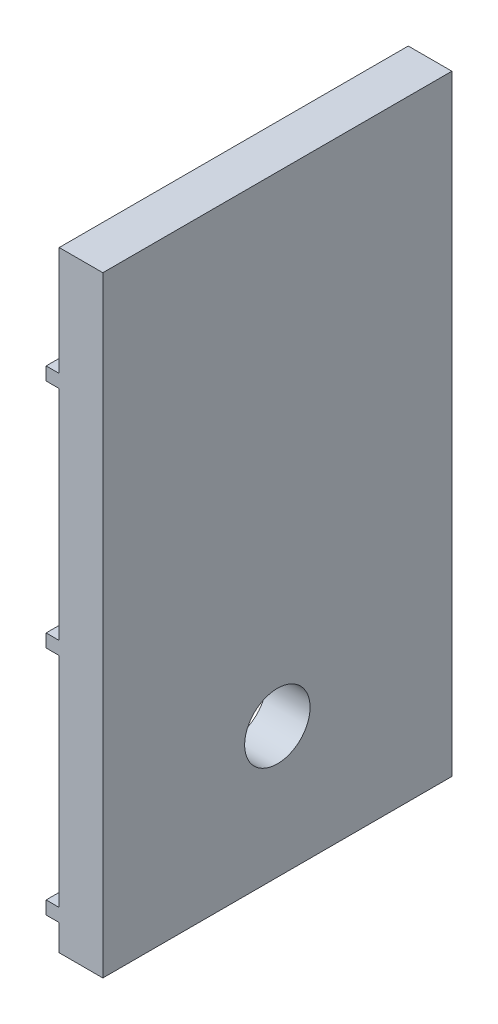
ISO-10303-21;
HEADER;
FILE_DESCRIPTION(('STEP AP214'),'2;1');
FILE_NAME('part.step','',(''),(''),'','','');
FILE_SCHEMA(('AUTOMOTIVE_DESIGN { 1 0 10303 214 1 1 1 1 }'));
ENDSEC;
DATA;
#1=APPLICATION_CONTEXT('core data for automotive mechanical design processes');
#2=APPLICATION_PROTOCOL_DEFINITION('international standard','automotive_design',2000,#1);
#3=PRODUCT_CONTEXT('',#1,'mechanical');
#4=PRODUCT('Part','Part','',(#3));
#5=PRODUCT_RELATED_PRODUCT_CATEGORY('part','',(#4));
#6=PRODUCT_DEFINITION_FORMATION('','',#4);
#7=PRODUCT_DEFINITION_CONTEXT('part definition',#1,'design');
#8=PRODUCT_DEFINITION('design','',#6,#7);
#9=PRODUCT_DEFINITION_SHAPE('','',#8);
#10=(LENGTH_UNIT() NAMED_UNIT(*) SI_UNIT(.MILLI.,.METRE.));
#11=(NAMED_UNIT(*) PLANE_ANGLE_UNIT() SI_UNIT($,.RADIAN.));
#12=(NAMED_UNIT(*) SI_UNIT($,.STERADIAN.) SOLID_ANGLE_UNIT());
#13=UNCERTAINTY_MEASURE_WITH_UNIT(LENGTH_MEASURE(1.E-05),#10,'distance_accuracy_value','');
#14=(GEOMETRIC_REPRESENTATION_CONTEXT(3) GLOBAL_UNCERTAINTY_ASSIGNED_CONTEXT((#13)) GLOBAL_UNIT_ASSIGNED_CONTEXT((#10,
#11,#12)) REPRESENTATION_CONTEXT('',''));
#15=CARTESIAN_POINT('',(0.,0.,0.));
#16=DIRECTION('',(0.,0.,1.));
#17=DIRECTION('',(1.,0.,0.));
#18=AXIS2_PLACEMENT_3D('',#15,#16,#17);
#19=CARTESIAN_POINT('',(-10.1086657496561,61.3713892709766,80.));
#20=DIRECTION('',(0.,-1.,0.));
#21=DIRECTION('',(0.,0.,-1.));
#22=AXIS2_PLACEMENT_3D('',#19,#20,#21);
#23=PLANE('',#22);
#24=DIRECTION('',(-1.,0.,0.));
#25=VECTOR('',#24,1.);
#26=CARTESIAN_POINT('',(-10.1086657496561,61.3713892709766,0.));
#27=LINE('',#26,#25);
#28=CARTESIAN_POINT('',(-10.1086657496561,61.3713892709766,0.));
#29=VERTEX_POINT('',#28);
#30=CARTESIAN_POINT('',(-20.1086657496561,61.3713892709766,0.));
#31=VERTEX_POINT('',#30);
#32=EDGE_CURVE('E192',#29,#31,#27,.T.);
#33=ORIENTED_EDGE('',*,*,#32,.T.);
#34=DIRECTION('',(0.,0.,-1.));
#35=VECTOR('',#34,1.);
#36=CARTESIAN_POINT('',(-20.1086657496561,61.3713892709766,80.));
#37=LINE('',#36,#35);
#38=CARTESIAN_POINT('',(-20.1086657496561,61.3713892709766,80.));
#39=VERTEX_POINT('',#38);
#40=EDGE_CURVE('E11',#39,#31,#37,.T.);
#41=ORIENTED_EDGE('',*,*,#40,.F.);
#42=DIRECTION('',(-1.,0.,0.));
#43=VECTOR('',#42,1.);
#44=CARTESIAN_POINT('',(-10.1086657496561,61.3713892709766,80.));
#45=LINE('',#44,#43);
#46=CARTESIAN_POINT('',(-10.1086657496561,61.3713892709766,80.));
#47=VERTEX_POINT('',#46);
#48=EDGE_CURVE('E238',#47,#39,#45,.T.);
#49=ORIENTED_EDGE('',*,*,#48,.F.);
#50=DIRECTION('',(0.,0.,-1.));
#51=VECTOR('',#50,1.);
#52=CARTESIAN_POINT('',(-10.1086657496561,61.3713892709766,80.));
#53=LINE('',#52,#51);
#54=EDGE_CURVE('E188',#47,#29,#53,.T.);
#55=ORIENTED_EDGE('',*,*,#54,.T.);
#56=EDGE_LOOP('',(#33,#41,#49,#55));
#57=FACE_BOUND('',#56,.T.);
#58=ADVANCED_FACE('F42',(#57),#23,.F.);
#59=CARTESIAN_POINT('',(-20.1086657496561,61.3713892709766,80.));
#60=DIRECTION('',(1.,0.,0.));
#61=DIRECTION('',(0.,1.,0.));
#62=AXIS2_PLACEMENT_3D('',#59,#60,#61);
#63=PLANE('',#62);
#64=DIRECTION('',(0.,-1.,0.));
#65=VECTOR('',#64,1.);
#66=CARTESIAN_POINT('',(-20.1086657496561,61.3713892709766,0.));
#67=LINE('',#66,#65);
#68=CARTESIAN_POINT('',(-20.1086657496561,36.3713892709766,0.));
#69=VERTEX_POINT('',#68);
#70=EDGE_CURVE('E196',#31,#69,#67,.T.);
#71=ORIENTED_EDGE('',*,*,#70,.T.);
#72=DIRECTION('',(0.,0.,-1.));
#73=VECTOR('',#72,1.);
#74=CARTESIAN_POINT('',(-20.1086657496561,36.3713892709766,80.));
#75=LINE('',#74,#73);
#76=CARTESIAN_POINT('',(-20.1086657496561,36.3713892709766,80.));
#77=VERTEX_POINT('',#76);
#78=EDGE_CURVE('E52',#77,#69,#75,.T.);
#79=ORIENTED_EDGE('',*,*,#78,.F.);
#80=DIRECTION('',(0.,-1.,0.));
#81=VECTOR('',#80,1.);
#82=CARTESIAN_POINT('',(-20.1086657496561,61.3713892709766,80.));
#83=LINE('',#82,#81);
#84=EDGE_CURVE('E127',#39,#77,#83,.T.);
#85=ORIENTED_EDGE('',*,*,#84,.F.);
#86=ORIENTED_EDGE('',*,*,#40,.T.);
#87=EDGE_LOOP('',(#71,#79,#85,#86));
#88=FACE_BOUND('',#87,.T.);
#89=ADVANCED_FACE('F363',(#88),#63,.F.);
#90=CARTESIAN_POINT('',(-20.1086657496561,36.3713892709766,80.));
#91=DIRECTION('',(0.,-1.,0.));
#92=DIRECTION('',(0.,0.,-1.));
#93=AXIS2_PLACEMENT_3D('',#90,#91,#92);
#94=PLANE('',#93);
#95=DIRECTION('',(-1.,0.,0.));
#96=VECTOR('',#95,1.);
#97=CARTESIAN_POINT('',(-20.1086657496561,36.3713892709766,0.));
#98=LINE('',#97,#96);
#99=CARTESIAN_POINT('',(-23.1086657496561,36.3713892709766,0.));
#100=VERTEX_POINT('',#99);
#101=EDGE_CURVE('E199',#69,#100,#98,.T.);
#102=ORIENTED_EDGE('',*,*,#101,.T.);
#103=DIRECTION('',(0.,0.,-1.));
#104=VECTOR('',#103,1.);
#105=CARTESIAN_POINT('',(-23.1086657496561,36.3713892709766,80.));
#106=LINE('',#105,#104);
#107=CARTESIAN_POINT('',(-23.1086657496561,36.3713892709766,80.));
#108=VERTEX_POINT('',#107);
#109=EDGE_CURVE('E281',#108,#100,#106,.T.);
#110=ORIENTED_EDGE('',*,*,#109,.F.);
#111=DIRECTION('',(-1.,0.,0.));
#112=VECTOR('',#111,1.);
#113=CARTESIAN_POINT('',(-20.1086657496561,36.3713892709766,80.));
#114=LINE('',#113,#112);
#115=EDGE_CURVE('E292',#77,#108,#114,.T.);
#116=ORIENTED_EDGE('',*,*,#115,.F.);
#117=ORIENTED_EDGE('',*,*,#78,.T.);
#118=EDGE_LOOP('',(#102,#110,#116,#117));
#119=FACE_BOUND('',#118,.T.);
#120=ADVANCED_FACE('F290',(#119),#94,.F.);
#121=CARTESIAN_POINT('',(-23.1086657496561,36.3713892709766,80.));
#122=DIRECTION('',(1.,0.,0.));
#123=DIRECTION('',(0.,0.,-1.));
#124=AXIS2_PLACEMENT_3D('',#121,#122,#123);
#125=PLANE('',#124);
#126=DIRECTION('',(0.,-1.,0.));
#127=VECTOR('',#126,1.);
#128=CARTESIAN_POINT('',(-23.1086657496561,36.3713892709766,0.));
#129=LINE('',#128,#127);
#130=CARTESIAN_POINT('',(-23.1086657496561,33.3713892709766,0.));
#131=VERTEX_POINT('',#130);
#132=EDGE_CURVE('E202',#100,#131,#129,.T.);
#133=ORIENTED_EDGE('',*,*,#132,.T.);
#134=DIRECTION('',(0.,0.,-1.));
#135=VECTOR('',#134,1.);
#136=CARTESIAN_POINT('',(-23.1086657496561,33.3713892709766,80.));
#137=LINE('',#136,#135);
#138=CARTESIAN_POINT('',(-23.1086657496561,33.3713892709766,80.));
#139=VERTEX_POINT('',#138);
#140=EDGE_CURVE('E277',#139,#131,#137,.T.);
#141=ORIENTED_EDGE('',*,*,#140,.F.);
#142=DIRECTION('',(0.,-1.,0.));
#143=VECTOR('',#142,1.);
#144=CARTESIAN_POINT('',(-23.1086657496561,36.3713892709766,80.));
#145=LINE('',#144,#143);
#146=EDGE_CURVE('E311',#108,#139,#145,.T.);
#147=ORIENTED_EDGE('',*,*,#146,.F.);
#148=ORIENTED_EDGE('',*,*,#109,.T.);
#149=EDGE_LOOP('',(#133,#141,#147,#148));
#150=FACE_BOUND('',#149,.T.);
#151=ADVANCED_FACE('F301',(#150),#125,.F.);
#152=CARTESIAN_POINT('',(-23.1086657496561,33.3713892709766,80.));
#153=DIRECTION('',(0.,1.,0.));
#154=DIRECTION('',(-1.,0.,0.));
#155=AXIS2_PLACEMENT_3D('',#152,#153,#154);
#156=PLANE('',#155);
#157=DIRECTION('',(1.,0.,0.));
#158=VECTOR('',#157,1.);
#159=CARTESIAN_POINT('',(-23.1086657496561,33.3713892709766,0.));
#160=LINE('',#159,#158);
#161=CARTESIAN_POINT('',(-20.1086657496561,33.3713892709766,0.));
#162=VERTEX_POINT('',#161);
#163=EDGE_CURVE('E205',#131,#162,#160,.T.);
#164=ORIENTED_EDGE('',*,*,#163,.T.);
#165=DIRECTION('',(0.,0.,-1.));
#166=VECTOR('',#165,1.);
#167=CARTESIAN_POINT('',(-20.1086657496561,33.3713892709766,80.));
#168=LINE('',#167,#166);
#169=CARTESIAN_POINT('',(-20.1086657496561,33.3713892709766,80.));
#170=VERTEX_POINT('',#169);
#171=EDGE_CURVE('E273',#170,#162,#168,.T.);
#172=ORIENTED_EDGE('',*,*,#171,.F.);
#173=DIRECTION('',(1.,0.,0.));
#174=VECTOR('',#173,1.);
#175=CARTESIAN_POINT('',(-23.1086657496561,33.3713892709766,80.));
#176=LINE('',#175,#174);
#177=EDGE_CURVE('E307',#139,#170,#176,.T.);
#178=ORIENTED_EDGE('',*,*,#177,.F.);
#179=ORIENTED_EDGE('',*,*,#140,.T.);
#180=EDGE_LOOP('',(#164,#172,#178,#179));
#181=FACE_BOUND('',#180,.T.);
#182=ADVANCED_FACE('F305',(#181),#156,.F.);
#183=CARTESIAN_POINT('',(-20.1086657496561,33.3713892709766,80.));
#184=DIRECTION('',(1.,0.,0.));
#185=DIRECTION('',(0.,1.,0.));
#186=AXIS2_PLACEMENT_3D('',#183,#184,#185);
#187=PLANE('',#186);
#188=DIRECTION('',(0.,-1.,0.));
#189=VECTOR('',#188,1.);
#190=CARTESIAN_POINT('',(-20.1086657496561,33.3713892709766,0.));
#191=LINE('',#190,#189);
#192=CARTESIAN_POINT('',(-20.1086657496561,-16.6286107290234,0.));
#193=VERTEX_POINT('',#192);
#194=EDGE_CURVE('E208',#162,#193,#191,.T.);
#195=ORIENTED_EDGE('',*,*,#194,.T.);
#196=DIRECTION('',(0.,0.,-1.));
#197=VECTOR('',#196,1.);
#198=CARTESIAN_POINT('',(-20.1086657496561,-16.6286107290234,80.));
#199=LINE('',#198,#197);
#200=CARTESIAN_POINT('',(-20.1086657496561,-16.6286107290234,80.));
#201=VERTEX_POINT('',#200);
#202=EDGE_CURVE('E269',#201,#193,#199,.T.);
#203=ORIENTED_EDGE('',*,*,#202,.F.);
#204=DIRECTION('',(0.,-1.,0.));
#205=VECTOR('',#204,1.);
#206=CARTESIAN_POINT('',(-20.1086657496561,33.3713892709766,80.));
#207=LINE('',#206,#205);
#208=EDGE_CURVE('E310',#170,#201,#207,.T.);
#209=ORIENTED_EDGE('',*,*,#208,.F.);
#210=ORIENTED_EDGE('',*,*,#171,.T.);
#211=EDGE_LOOP('',(#195,#203,#209,#210));
#212=FACE_BOUND('',#211,.T.);
#213=ADVANCED_FACE('F376',(#212),#187,.F.);
#214=CARTESIAN_POINT('',(-20.1086657496561,-16.6286107290234,80.));
#215=DIRECTION('',(0.,-1.,0.));
#216=DIRECTION('',(1.,0.,0.));
#217=AXIS2_PLACEMENT_3D('',#214,#215,#216);
#218=PLANE('',#217);
#219=DIRECTION('',(-1.,0.,0.));
#220=VECTOR('',#219,1.);
#221=CARTESIAN_POINT('',(-20.1086657496561,-16.6286107290234,0.));
#222=LINE('',#221,#220);
#223=CARTESIAN_POINT('',(-23.1086657496561,-16.6286107290234,0.));
#224=VERTEX_POINT('',#223);
#225=EDGE_CURVE('E211',#193,#224,#222,.T.);
#226=ORIENTED_EDGE('',*,*,#225,.T.);
#227=DIRECTION('',(0.,0.,-1.));
#228=VECTOR('',#227,1.);
#229=CARTESIAN_POINT('',(-23.1086657496561,-16.6286107290234,80.));
#230=LINE('',#229,#228);
#231=CARTESIAN_POINT('',(-23.1086657496561,-16.6286107290234,80.));
#232=VERTEX_POINT('',#231);
#233=EDGE_CURVE('E265',#232,#224,#230,.T.);
#234=ORIENTED_EDGE('',*,*,#233,.F.);
#235=DIRECTION('',(-1.,0.,0.));
#236=VECTOR('',#235,1.);
#237=CARTESIAN_POINT('',(-20.1086657496561,-16.6286107290234,80.));
#238=LINE('',#237,#236);
#239=EDGE_CURVE('E315',#201,#232,#238,.T.);
#240=ORIENTED_EDGE('',*,*,#239,.F.);
#241=ORIENTED_EDGE('',*,*,#202,.T.);
#242=EDGE_LOOP('',(#226,#234,#240,#241));
#243=FACE_BOUND('',#242,.T.);
#244=ADVANCED_FACE('F379',(#243),#218,.F.);
#245=CARTESIAN_POINT('',(-23.1086657496561,-16.6286107290234,80.));
#246=DIRECTION('',(1.,0.,0.));
#247=DIRECTION('',(0.,0.,-1.));
#248=AXIS2_PLACEMENT_3D('',#245,#246,#247);
#249=PLANE('',#248);
#250=DIRECTION('',(0.,-1.,0.));
#251=VECTOR('',#250,1.);
#252=CARTESIAN_POINT('',(-23.1086657496561,-16.6286107290234,0.));
#253=LINE('',#252,#251);
#254=CARTESIAN_POINT('',(-23.1086657496561,-19.6286107290234,0.));
#255=VERTEX_POINT('',#254);
#256=EDGE_CURVE('E214',#224,#255,#253,.T.);
#257=ORIENTED_EDGE('',*,*,#256,.T.);
#258=DIRECTION('',(0.,0.,-1.));
#259=VECTOR('',#258,1.);
#260=CARTESIAN_POINT('',(-23.1086657496561,-19.6286107290234,80.));
#261=LINE('',#260,#259);
#262=CARTESIAN_POINT('',(-23.1086657496561,-19.6286107290234,80.));
#263=VERTEX_POINT('',#262);
#264=EDGE_CURVE('E261',#263,#255,#261,.T.);
#265=ORIENTED_EDGE('',*,*,#264,.F.);
#266=DIRECTION('',(0.,-1.,0.));
#267=VECTOR('',#266,1.);
#268=CARTESIAN_POINT('',(-23.1086657496561,-16.6286107290234,80.));
#269=LINE('',#268,#267);
#270=EDGE_CURVE('E322',#232,#263,#269,.T.);
#271=ORIENTED_EDGE('',*,*,#270,.F.);
#272=ORIENTED_EDGE('',*,*,#233,.T.);
#273=EDGE_LOOP('',(#257,#265,#271,#272));
#274=FACE_BOUND('',#273,.T.);
#275=ADVANCED_FACE('F383',(#274),#249,.F.);
#276=CARTESIAN_POINT('',(-23.1086657496561,-19.6286107290234,80.));
#277=DIRECTION('',(0.,1.,0.));
#278=DIRECTION('',(0.,0.,1.));
#279=AXIS2_PLACEMENT_3D('',#276,#277,#278);
#280=PLANE('',#279);
#281=DIRECTION('',(1.,0.,0.));
#282=VECTOR('',#281,1.);
#283=CARTESIAN_POINT('',(-23.1086657496561,-19.6286107290234,0.));
#284=LINE('',#283,#282);
#285=CARTESIAN_POINT('',(-20.1086657496561,-19.6286107290234,0.));
#286=VERTEX_POINT('',#285);
#287=EDGE_CURVE('E217',#255,#286,#284,.T.);
#288=ORIENTED_EDGE('',*,*,#287,.T.);
#289=DIRECTION('',(0.,0.,-1.));
#290=VECTOR('',#289,1.);
#291=CARTESIAN_POINT('',(-20.1086657496561,-19.6286107290234,80.));
#292=LINE('',#291,#290);
#293=CARTESIAN_POINT('',(-20.1086657496561,-19.6286107290234,80.));
#294=VERTEX_POINT('',#293);
#295=EDGE_CURVE('E257',#294,#286,#292,.T.);
#296=ORIENTED_EDGE('',*,*,#295,.F.);
#297=DIRECTION('',(1.,0.,0.));
#298=VECTOR('',#297,1.);
#299=CARTESIAN_POINT('',(-23.1086657496561,-19.6286107290234,80.));
#300=LINE('',#299,#298);
#301=EDGE_CURVE('E325',#263,#294,#300,.T.);
#302=ORIENTED_EDGE('',*,*,#301,.F.);
#303=ORIENTED_EDGE('',*,*,#264,.T.);
#304=EDGE_LOOP('',(#288,#296,#302,#303));
#305=FACE_BOUND('',#304,.T.);
#306=ADVANCED_FACE('F387',(#305),#280,.F.);
#307=CARTESIAN_POINT('',(-20.1086657496561,-19.6286107290234,80.));
#308=DIRECTION('',(1.,0.,0.));
#309=DIRECTION('',(0.,1.,0.));
#310=AXIS2_PLACEMENT_3D('',#307,#308,#309);
#311=PLANE('',#310);
#312=CARTESIAN_POINT('',(-20.1086657496561,-48.6286107290234,40.));
#313=DIRECTION('',(-1.,0.,0.));
#314=DIRECTION('',(0.,-1.,0.));
#315=AXIS2_PLACEMENT_3D('',#312,#313,#314);
#316=CIRCLE('',#315,7.5);
#317=CARTESIAN_POINT('',(-20.1086657496561,-56.1286107290234,40.));
#318=VERTEX_POINT('',#317);
#319=EDGE_CURVE('E559',#318,#318,#316,.T.);
#320=ORIENTED_EDGE('',*,*,#319,.F.);
#321=EDGE_LOOP('',(#320));
#322=FACE_BOUND('',#321,.T.);
#323=DIRECTION('',(0.,-1.,0.));
#324=VECTOR('',#323,1.);
#325=CARTESIAN_POINT('',(-20.1086657496561,-19.6286107290234,0.));
#326=LINE('',#325,#324);
#327=CARTESIAN_POINT('',(-20.1086657496561,-69.6286107290234,0.));
#328=VERTEX_POINT('',#327);
#329=EDGE_CURVE('E220',#286,#328,#326,.T.);
#330=ORIENTED_EDGE('',*,*,#329,.T.);
#331=DIRECTION('',(0.,0.,-1.));
#332=VECTOR('',#331,1.);
#333=CARTESIAN_POINT('',(-20.1086657496561,-69.6286107290234,80.));
#334=LINE('',#333,#332);
#335=CARTESIAN_POINT('',(-20.1086657496561,-69.6286107290234,80.));
#336=VERTEX_POINT('',#335);
#337=EDGE_CURVE('E253',#336,#328,#334,.T.);
#338=ORIENTED_EDGE('',*,*,#337,.F.);
#339=DIRECTION('',(0.,-1.,0.));
#340=VECTOR('',#339,1.);
#341=CARTESIAN_POINT('',(-20.1086657496561,-19.6286107290234,80.));
#342=LINE('',#341,#340);
#343=EDGE_CURVE('E328',#294,#336,#342,.T.);
#344=ORIENTED_EDGE('',*,*,#343,.F.);
#345=ORIENTED_EDGE('',*,*,#295,.T.);
#346=EDGE_LOOP('',(#330,#338,#344,#345));
#347=FACE_BOUND('',#346,.T.);
#348=ADVANCED_FACE('F391',(#322,#347),#311,.F.);
#349=CARTESIAN_POINT('',(-20.1086657496561,-69.6286107290234,80.));
#350=DIRECTION('',(0.,-1.,0.));
#351=DIRECTION('',(0.,0.,-1.));
#352=AXIS2_PLACEMENT_3D('',#349,#350,#351);
#353=PLANE('',#352);
#354=DIRECTION('',(-1.,0.,0.));
#355=VECTOR('',#354,1.);
#356=CARTESIAN_POINT('',(-20.1086657496561,-69.6286107290234,0.));
#357=LINE('',#356,#355);
#358=CARTESIAN_POINT('',(-23.1086657496561,-69.6286107290234,0.));
#359=VERTEX_POINT('',#358);
#360=EDGE_CURVE('E223',#328,#359,#357,.T.);
#361=ORIENTED_EDGE('',*,*,#360,.T.);
#362=DIRECTION('',(0.,0.,-1.));
#363=VECTOR('',#362,1.);
#364=CARTESIAN_POINT('',(-23.1086657496561,-69.6286107290234,80.));
#365=LINE('',#364,#363);
#366=CARTESIAN_POINT('',(-23.1086657496561,-69.6286107290234,80.));
#367=VERTEX_POINT('',#366);
#368=EDGE_CURVE('E249',#367,#359,#365,.T.);
#369=ORIENTED_EDGE('',*,*,#368,.F.);
#370=DIRECTION('',(-1.,0.,0.));
#371=VECTOR('',#370,1.);
#372=CARTESIAN_POINT('',(-20.1086657496561,-69.6286107290234,80.));
#373=LINE('',#372,#371);
#374=EDGE_CURVE('E331',#336,#367,#373,.T.);
#375=ORIENTED_EDGE('',*,*,#374,.F.);
#376=ORIENTED_EDGE('',*,*,#337,.T.);
#377=EDGE_LOOP('',(#361,#369,#375,#376));
#378=FACE_BOUND('',#377,.T.);
#379=ADVANCED_FACE('F395',(#378),#353,.F.);
#380=CARTESIAN_POINT('',(-23.1086657496561,-69.6286107290234,80.));
#381=DIRECTION('',(1.,0.,0.));
#382=DIRECTION('',(0.,0.,-1.));
#383=AXIS2_PLACEMENT_3D('',#380,#381,#382);
#384=PLANE('',#383);
#385=DIRECTION('',(0.,-1.,0.));
#386=VECTOR('',#385,1.);
#387=CARTESIAN_POINT('',(-23.1086657496561,-69.6286107290234,0.));
#388=LINE('',#387,#386);
#389=CARTESIAN_POINT('',(-23.1086657496561,-72.6286107290234,0.));
#390=VERTEX_POINT('',#389);
#391=EDGE_CURVE('E226',#359,#390,#388,.T.);
#392=ORIENTED_EDGE('',*,*,#391,.T.);
#393=DIRECTION('',(0.,0.,-1.));
#394=VECTOR('',#393,1.);
#395=CARTESIAN_POINT('',(-23.1086657496561,-72.6286107290234,80.));
#396=LINE('',#395,#394);
#397=CARTESIAN_POINT('',(-23.1086657496561,-72.6286107290234,80.));
#398=VERTEX_POINT('',#397);
#399=EDGE_CURVE('E245',#398,#390,#396,.T.);
#400=ORIENTED_EDGE('',*,*,#399,.F.);
#401=DIRECTION('',(0.,-1.,0.));
#402=VECTOR('',#401,1.);
#403=CARTESIAN_POINT('',(-23.1086657496561,-69.6286107290234,80.));
#404=LINE('',#403,#402);
#405=EDGE_CURVE('E334',#367,#398,#404,.T.);
#406=ORIENTED_EDGE('',*,*,#405,.F.);
#407=ORIENTED_EDGE('',*,*,#368,.T.);
#408=EDGE_LOOP('',(#392,#400,#406,#407));
#409=FACE_BOUND('',#408,.T.);
#410=ADVANCED_FACE('F342',(#409),#384,.F.);
#411=CARTESIAN_POINT('',(-23.1086657496561,-72.6286107290234,80.));
#412=DIRECTION('',(0.,1.,0.));
#413=DIRECTION('',(0.,0.,1.));
#414=AXIS2_PLACEMENT_3D('',#411,#412,#413);
#415=PLANE('',#414);
#416=DIRECTION('',(1.,0.,0.));
#417=VECTOR('',#416,1.);
#418=CARTESIAN_POINT('',(-23.1086657496561,-72.6286107290234,0.));
#419=LINE('',#418,#417);
#420=CARTESIAN_POINT('',(-20.1086657496561,-72.6286107290234,0.));
#421=VERTEX_POINT('',#420);
#422=EDGE_CURVE('E229',#390,#421,#419,.T.);
#423=ORIENTED_EDGE('',*,*,#422,.T.);
#424=DIRECTION('',(0.,0.,-1.));
#425=VECTOR('',#424,1.);
#426=CARTESIAN_POINT('',(-20.1086657496561,-72.6286107290234,80.));
#427=LINE('',#426,#425);
#428=CARTESIAN_POINT('',(-20.1086657496561,-72.6286107290234,80.));
#429=VERTEX_POINT('',#428);
#430=EDGE_CURVE('E181',#429,#421,#427,.T.);
#431=ORIENTED_EDGE('',*,*,#430,.F.);
#432=DIRECTION('',(1.,0.,0.));
#433=VECTOR('',#432,1.);
#434=CARTESIAN_POINT('',(-23.1086657496561,-72.6286107290234,80.));
#435=LINE('',#434,#433);
#436=EDGE_CURVE('E170',#398,#429,#435,.T.);
#437=ORIENTED_EDGE('',*,*,#436,.F.);
#438=ORIENTED_EDGE('',*,*,#399,.T.);
#439=EDGE_LOOP('',(#423,#431,#437,#438));
#440=FACE_BOUND('',#439,.T.);
#441=ADVANCED_FACE('F346',(#440),#415,.F.);
#442=CARTESIAN_POINT('',(-20.1086657496561,-72.6286107290234,80.));
#443=DIRECTION('',(1.,0.,0.));
#444=DIRECTION('',(0.,0.,-1.));
#445=AXIS2_PLACEMENT_3D('',#442,#443,#444);
#446=PLANE('',#445);
#447=DIRECTION('',(0.,-1.,0.));
#448=VECTOR('',#447,1.);
#449=CARTESIAN_POINT('',(-20.1086657496561,-72.6286107290234,0.));
#450=LINE('',#449,#448);
#451=CARTESIAN_POINT('',(-20.1086657496561,-78.6286107290234,0.));
#452=VERTEX_POINT('',#451);
#453=EDGE_CURVE('E179',#421,#452,#450,.T.);
#454=ORIENTED_EDGE('',*,*,#453,.T.);
#455=DIRECTION('',(0.,0.,-1.));
#456=VECTOR('',#455,1.);
#457=CARTESIAN_POINT('',(-20.1086657496561,-78.6286107290234,80.));
#458=LINE('',#457,#456);
#459=CARTESIAN_POINT('',(-20.1086657496561,-78.6286107290234,80.));
#460=VERTEX_POINT('',#459);
#461=EDGE_CURVE('E176',#460,#452,#458,.T.);
#462=ORIENTED_EDGE('',*,*,#461,.F.);
#463=DIRECTION('',(0.,-1.,0.));
#464=VECTOR('',#463,1.);
#465=CARTESIAN_POINT('',(-20.1086657496561,-72.6286107290234,80.));
#466=LINE('',#465,#464);
#467=EDGE_CURVE('E164',#429,#460,#466,.T.);
#468=ORIENTED_EDGE('',*,*,#467,.F.);
#469=ORIENTED_EDGE('',*,*,#430,.T.);
#470=EDGE_LOOP('',(#454,#462,#468,#469));
#471=FACE_BOUND('',#470,.T.);
#472=ADVANCED_FACE('F177',(#471),#446,.F.);
#473=CARTESIAN_POINT('',(-20.1086657496561,-78.6286107290234,80.));
#474=DIRECTION('',(0.,1.,0.));
#475=DIRECTION('',(0.,0.,1.));
#476=AXIS2_PLACEMENT_3D('',#473,#474,#475);
#477=PLANE('',#476);
#478=DIRECTION('',(1.,0.,0.));
#479=VECTOR('',#478,1.);
#480=CARTESIAN_POINT('',(-20.1086657496561,-78.6286107290234,0.));
#481=LINE('',#480,#479);
#482=CARTESIAN_POINT('',(-10.1086657496561,-78.6286107290234,0.));
#483=VERTEX_POINT('',#482);
#484=EDGE_CURVE('E113',#452,#483,#481,.T.);
#485=ORIENTED_EDGE('',*,*,#484,.T.);
#486=DIRECTION('',(0.,0.,-1.));
#487=VECTOR('',#486,1.);
#488=CARTESIAN_POINT('',(-10.1086657496561,-78.6286107290234,80.));
#489=LINE('',#488,#487);
#490=CARTESIAN_POINT('',(-10.1086657496561,-78.6286107290234,80.));
#491=VERTEX_POINT('',#490);
#492=EDGE_CURVE('E182',#491,#483,#489,.T.);
#493=ORIENTED_EDGE('',*,*,#492,.F.);
#494=DIRECTION('',(1.,0.,0.));
#495=VECTOR('',#494,1.);
#496=CARTESIAN_POINT('',(-20.1086657496561,-78.6286107290234,80.));
#497=LINE('',#496,#495);
#498=EDGE_CURVE('E168',#460,#491,#497,.T.);
#499=ORIENTED_EDGE('',*,*,#498,.F.);
#500=ORIENTED_EDGE('',*,*,#461,.T.);
#501=EDGE_LOOP('',(#485,#493,#499,#500));
#502=FACE_BOUND('',#501,.T.);
#503=ADVANCED_FACE('F184',(#502),#477,.F.);
#504=CARTESIAN_POINT('',(-10.1086657496561,-78.6286107290234,80.));
#505=DIRECTION('',(-1.,0.,0.));
#506=DIRECTION('',(0.,-1.,0.));
#507=AXIS2_PLACEMENT_3D('',#504,#505,#506);
#508=PLANE('',#507);
#509=CARTESIAN_POINT('',(-10.1086657496561,-48.6286107290234,40.));
#510=DIRECTION('',(-1.,0.,0.));
#511=DIRECTION('',(0.,-1.,0.));
#512=AXIS2_PLACEMENT_3D('',#509,#510,#511);
#513=CIRCLE('',#512,7.5);
#514=CARTESIAN_POINT('',(-10.1086657496561,-56.1286107290234,40.));
#515=VERTEX_POINT('',#514);
#516=EDGE_CURVE('E45',#515,#515,#513,.T.);
#517=ORIENTED_EDGE('',*,*,#516,.T.);
#518=EDGE_LOOP('',(#517));
#519=FACE_BOUND('',#518,.T.);
#520=DIRECTION('',(0.,1.,0.));
#521=VECTOR('',#520,1.);
#522=CARTESIAN_POINT('',(-10.1086657496561,-78.6286107290234,0.));
#523=LINE('',#522,#521);
#524=EDGE_CURVE('E119',#483,#29,#523,.T.);
#525=ORIENTED_EDGE('',*,*,#524,.T.);
#526=ORIENTED_EDGE('',*,*,#54,.F.);
#527=DIRECTION('',(0.,1.,0.));
#528=VECTOR('',#527,1.);
#529=CARTESIAN_POINT('',(-10.1086657496561,-78.6286107290234,80.));
#530=LINE('',#529,#528);
#531=EDGE_CURVE('E60',#491,#47,#530,.T.);
#532=ORIENTED_EDGE('',*,*,#531,.F.);
#533=ORIENTED_EDGE('',*,*,#492,.T.);
#534=EDGE_LOOP('',(#525,#526,#532,#533));
#535=FACE_BOUND('',#534,.T.);
#536=ADVANCED_FACE('F350',(#519,#535),#508,.F.);
#537=CARTESIAN_POINT('',(0.,0.,80.));
#538=DIRECTION('',(0.,0.,1.));
#539=DIRECTION('',(1.,0.,0.));
#540=AXIS2_PLACEMENT_3D('',#537,#538,#539);
#541=PLANE('',#540);
#542=ORIENTED_EDGE('',*,*,#48,.T.);
#543=ORIENTED_EDGE('',*,*,#84,.T.);
#544=ORIENTED_EDGE('',*,*,#115,.T.);
#545=ORIENTED_EDGE('',*,*,#146,.T.);
#546=ORIENTED_EDGE('',*,*,#177,.T.);
#547=ORIENTED_EDGE('',*,*,#208,.T.);
#548=ORIENTED_EDGE('',*,*,#239,.T.);
#549=ORIENTED_EDGE('',*,*,#270,.T.);
#550=ORIENTED_EDGE('',*,*,#301,.T.);
#551=ORIENTED_EDGE('',*,*,#343,.T.);
#552=ORIENTED_EDGE('',*,*,#374,.T.);
#553=ORIENTED_EDGE('',*,*,#405,.T.);
#554=ORIENTED_EDGE('',*,*,#436,.T.);
#555=ORIENTED_EDGE('',*,*,#467,.T.);
#556=ORIENTED_EDGE('',*,*,#498,.T.);
#557=ORIENTED_EDGE('',*,*,#531,.T.);
#558=EDGE_LOOP('',(#542,#543,#544,#545,#546,#547,#548,#549,#550,#551,#552,#553,#554,#555,#556,#557));
#559=FACE_BOUND('',#558,.T.);
#560=ADVANCED_FACE('F166',(#559),#541,.T.);
#561=CARTESIAN_POINT('',(0.,0.,0.));
#562=DIRECTION('',(0.,0.,1.));
#563=DIRECTION('',(1.,0.,0.));
#564=AXIS2_PLACEMENT_3D('',#561,#562,#563);
#565=PLANE('',#564);
#566=ORIENTED_EDGE('',*,*,#32,.F.);
#567=ORIENTED_EDGE('',*,*,#524,.F.);
#568=ORIENTED_EDGE('',*,*,#484,.F.);
#569=ORIENTED_EDGE('',*,*,#453,.F.);
#570=ORIENTED_EDGE('',*,*,#422,.F.);
#571=ORIENTED_EDGE('',*,*,#391,.F.);
#572=ORIENTED_EDGE('',*,*,#360,.F.);
#573=ORIENTED_EDGE('',*,*,#329,.F.);
#574=ORIENTED_EDGE('',*,*,#287,.F.);
#575=ORIENTED_EDGE('',*,*,#256,.F.);
#576=ORIENTED_EDGE('',*,*,#225,.F.);
#577=ORIENTED_EDGE('',*,*,#194,.F.);
#578=ORIENTED_EDGE('',*,*,#163,.F.);
#579=ORIENTED_EDGE('',*,*,#132,.F.);
#580=ORIENTED_EDGE('',*,*,#101,.F.);
#581=ORIENTED_EDGE('',*,*,#70,.F.);
#582=EDGE_LOOP('',(#566,#567,#568,#569,#570,#571,#572,#573,#574,#575,#576,#577,#578,#579,#580,#581));
#583=FACE_BOUND('',#582,.T.);
#584=ADVANCED_FACE('F296',(#583),#565,.F.);
#585=CARTESIAN_POINT('',(59.8913342503439,-48.6286107290233,40.));
#586=DIRECTION('',(-1.,0.,0.));
#587=DIRECTION('',(0.,-1.,0.));
#588=AXIS2_PLACEMENT_3D('',#585,#586,#587);
#589=CYLINDRICAL_SURFACE('',#588,7.5);
#590=ORIENTED_EDGE('',*,*,#319,.T.);
#591=EDGE_LOOP('',(#590));
#592=FACE_BOUND('',#591,.T.);
#593=ORIENTED_EDGE('',*,*,#516,.F.);
#594=EDGE_LOOP('',(#593));
#595=FACE_BOUND('',#594,.T.);
#596=ADVANCED_FACE('F431',(#592,#595),#589,.F.);
#597=CLOSED_SHELL('',(#58,#89,#120,#151,#182,#213,#244,#275,#306,#348,#379,#410,#441,#472,#503,
#536,#560,#584,#596));
#598=MANIFOLD_SOLID_BREP('B2',#597);
#599=ADVANCED_BREP_SHAPE_REPRESENTATION('',(#18,#598),#14);
#600=SHAPE_DEFINITION_REPRESENTATION(#9,#599);
ENDSEC;
END-ISO-10303-21;
